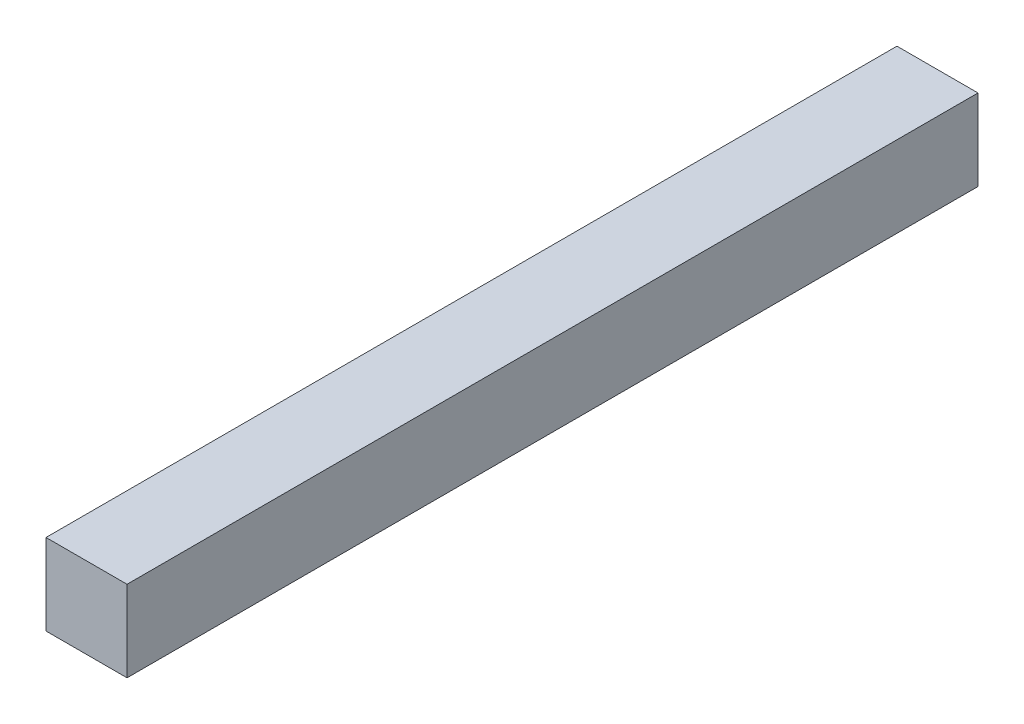
ISO-10303-21;
HEADER;
FILE_DESCRIPTION(('STEP AP214'),'2;1');
FILE_NAME('part.step','',(''),(''),'','','');
FILE_SCHEMA(('AUTOMOTIVE_DESIGN { 1 0 10303 214 1 1 1 1 }'));
ENDSEC;
DATA;
#1=APPLICATION_CONTEXT('core data for automotive mechanical design processes');
#2=APPLICATION_PROTOCOL_DEFINITION('international standard','automotive_design',2000,#1);
#3=PRODUCT_CONTEXT('',#1,'mechanical');
#4=PRODUCT('Part','Part','',(#3));
#5=PRODUCT_RELATED_PRODUCT_CATEGORY('part','',(#4));
#6=PRODUCT_DEFINITION_FORMATION('','',#4);
#7=PRODUCT_DEFINITION_CONTEXT('part definition',#1,'design');
#8=PRODUCT_DEFINITION('design','',#6,#7);
#9=PRODUCT_DEFINITION_SHAPE('','',#8);
#10=(LENGTH_UNIT() NAMED_UNIT(*) SI_UNIT(.MILLI.,.METRE.));
#11=(NAMED_UNIT(*) PLANE_ANGLE_UNIT() SI_UNIT($,.RADIAN.));
#12=(NAMED_UNIT(*) SI_UNIT($,.STERADIAN.) SOLID_ANGLE_UNIT());
#13=UNCERTAINTY_MEASURE_WITH_UNIT(LENGTH_MEASURE(1.E-05),#10,'distance_accuracy_value','');
#14=(GEOMETRIC_REPRESENTATION_CONTEXT(3) GLOBAL_UNCERTAINTY_ASSIGNED_CONTEXT((#13)) GLOBAL_UNIT_ASSIGNED_CONTEXT((#10,
#11,#12)) REPRESENTATION_CONTEXT('',''));
#15=CARTESIAN_POINT('',(0.,0.,0.));
#16=DIRECTION('',(0.,0.,1.));
#17=DIRECTION('',(1.,0.,0.));
#18=AXIS2_PLACEMENT_3D('',#15,#16,#17);
#19=CARTESIAN_POINT('',(0.,0.,66.675));
#20=DIRECTION('',(-1.,0.,0.));
#21=DIRECTION('',(0.,-1.,0.));
#22=AXIS2_PLACEMENT_3D('',#19,#20,#21);
#23=PLANE('',#22);
#24=DIRECTION('',(0.,1.,0.));
#25=VECTOR('',#24,1.);
#26=CARTESIAN_POINT('',(0.,0.,0.));
#27=LINE('',#26,#25);
#28=CARTESIAN_POINT('',(0.,0.,0.));
#29=VERTEX_POINT('',#28);
#30=CARTESIAN_POINT('',(0.,6.35,0.));
#31=VERTEX_POINT('',#30);
#32=EDGE_CURVE('E96',#29,#31,#27,.T.);
#33=ORIENTED_EDGE('',*,*,#32,.T.);
#34=DIRECTION('',(0.,0.,-1.));
#35=VECTOR('',#34,1.);
#36=CARTESIAN_POINT('',(0.,6.35,66.675));
#37=LINE('',#36,#35);
#38=CARTESIAN_POINT('',(0.,6.35,66.675));
#39=VERTEX_POINT('',#38);
#40=EDGE_CURVE('E11',#39,#31,#37,.T.);
#41=ORIENTED_EDGE('',*,*,#40,.F.);
#42=DIRECTION('',(0.,1.,0.));
#43=VECTOR('',#42,1.);
#44=CARTESIAN_POINT('',(0.,0.,66.675));
#45=LINE('',#44,#43);
#46=CARTESIAN_POINT('',(0.,0.,66.675));
#47=VERTEX_POINT('',#46);
#48=EDGE_CURVE('E84',#47,#39,#45,.T.);
#49=ORIENTED_EDGE('',*,*,#48,.F.);
#50=DIRECTION('',(0.,0.,-1.));
#51=VECTOR('',#50,1.);
#52=CARTESIAN_POINT('',(0.,0.,66.675));
#53=LINE('',#52,#51);
#54=EDGE_CURVE('E92',#47,#29,#53,.T.);
#55=ORIENTED_EDGE('',*,*,#54,.T.);
#56=EDGE_LOOP('',(#33,#41,#49,#55));
#57=FACE_BOUND('',#56,.T.);
#58=ADVANCED_FACE('F33',(#57),#23,.F.);
#59=CARTESIAN_POINT('',(0.,6.35,66.675));
#60=DIRECTION('',(0.,-1.,0.));
#61=DIRECTION('',(1.,0.,0.));
#62=AXIS2_PLACEMENT_3D('',#59,#60,#61);
#63=PLANE('',#62);
#64=DIRECTION('',(-1.,0.,0.));
#65=VECTOR('',#64,1.);
#66=CARTESIAN_POINT('',(0.,6.35,0.));
#67=LINE('',#66,#65);
#68=CARTESIAN_POINT('',(-6.35,6.35,0.));
#69=VERTEX_POINT('',#68);
#70=EDGE_CURVE('E88',#31,#69,#67,.T.);
#71=ORIENTED_EDGE('',*,*,#70,.T.);
#72=DIRECTION('',(0.,0.,-1.));
#73=VECTOR('',#72,1.);
#74=CARTESIAN_POINT('',(-6.35,6.35,66.675));
#75=LINE('',#74,#73);
#76=CARTESIAN_POINT('',(-6.35,6.35,66.675));
#77=VERTEX_POINT('',#76);
#78=EDGE_CURVE('E41',#77,#69,#75,.T.);
#79=ORIENTED_EDGE('',*,*,#78,.F.);
#80=DIRECTION('',(-1.,0.,0.));
#81=VECTOR('',#80,1.);
#82=CARTESIAN_POINT('',(0.,6.35,66.675));
#83=LINE('',#82,#81);
#84=EDGE_CURVE('E79',#39,#77,#83,.T.);
#85=ORIENTED_EDGE('',*,*,#84,.F.);
#86=ORIENTED_EDGE('',*,*,#40,.T.);
#87=EDGE_LOOP('',(#71,#79,#85,#86));
#88=FACE_BOUND('',#87,.T.);
#89=ADVANCED_FACE('F87',(#88),#63,.F.);
#90=CARTESIAN_POINT('',(-6.35,0.,66.675));
#91=DIRECTION('',(1.,0.,0.));
#92=DIRECTION('',(0.,0.,-1.));
#93=AXIS2_PLACEMENT_3D('',#90,#91,#92);
#94=PLANE('',#93);
#95=DIRECTION('',(0.,-1.,0.));
#96=VECTOR('',#95,1.);
#97=CARTESIAN_POINT('',(-6.35,0.,0.));
#98=LINE('',#97,#96);
#99=CARTESIAN_POINT('',(-6.35,0.,0.));
#100=VERTEX_POINT('',#99);
#101=EDGE_CURVE('E66',#69,#100,#98,.T.);
#102=ORIENTED_EDGE('',*,*,#101,.T.);
#103=DIRECTION('',(0.,0.,-1.));
#104=VECTOR('',#103,1.);
#105=CARTESIAN_POINT('',(-6.35,0.,66.675));
#106=LINE('',#105,#104);
#107=CARTESIAN_POINT('',(-6.35,0.,66.675));
#108=VERTEX_POINT('',#107);
#109=EDGE_CURVE('E89',#108,#100,#106,.T.);
#110=ORIENTED_EDGE('',*,*,#109,.F.);
#111=DIRECTION('',(0.,-1.,0.));
#112=VECTOR('',#111,1.);
#113=CARTESIAN_POINT('',(-6.35,0.,66.675));
#114=LINE('',#113,#112);
#115=EDGE_CURVE('E82',#77,#108,#114,.T.);
#116=ORIENTED_EDGE('',*,*,#115,.F.);
#117=ORIENTED_EDGE('',*,*,#78,.T.);
#118=EDGE_LOOP('',(#102,#110,#116,#117));
#119=FACE_BOUND('',#118,.T.);
#120=ADVANCED_FACE('F90',(#119),#94,.F.);
#121=CARTESIAN_POINT('',(0.,0.,66.675));
#122=DIRECTION('',(0.,1.,0.));
#123=DIRECTION('',(0.,0.,1.));
#124=AXIS2_PLACEMENT_3D('',#121,#122,#123);
#125=PLANE('',#124);
#126=DIRECTION('',(1.,0.,0.));
#127=VECTOR('',#126,1.);
#128=CARTESIAN_POINT('',(0.,0.,0.));
#129=LINE('',#128,#127);
#130=EDGE_CURVE('E72',#100,#29,#129,.T.);
#131=ORIENTED_EDGE('',*,*,#130,.T.);
#132=ORIENTED_EDGE('',*,*,#54,.F.);
#133=DIRECTION('',(1.,0.,0.));
#134=VECTOR('',#133,1.);
#135=CARTESIAN_POINT('',(0.,0.,66.675));
#136=LINE('',#135,#134);
#137=EDGE_CURVE('E49',#108,#47,#136,.T.);
#138=ORIENTED_EDGE('',*,*,#137,.F.);
#139=ORIENTED_EDGE('',*,*,#109,.T.);
#140=EDGE_LOOP('',(#131,#132,#138,#139));
#141=FACE_BOUND('',#140,.T.);
#142=ADVANCED_FACE('F103',(#141),#125,.F.);
#143=CARTESIAN_POINT('',(0.,0.,66.675));
#144=DIRECTION('',(0.,0.,1.));
#145=DIRECTION('',(1.,0.,0.));
#146=AXIS2_PLACEMENT_3D('',#143,#144,#145);
#147=PLANE('',#146);
#148=ORIENTED_EDGE('',*,*,#48,.T.);
#149=ORIENTED_EDGE('',*,*,#84,.T.);
#150=ORIENTED_EDGE('',*,*,#115,.T.);
#151=ORIENTED_EDGE('',*,*,#137,.T.);
#152=EDGE_LOOP('',(#148,#149,#150,#151));
#153=FACE_BOUND('',#152,.T.);
#154=ADVANCED_FACE('F80',(#153),#147,.T.);
#155=CARTESIAN_POINT('',(0.,0.,0.));
#156=DIRECTION('',(0.,0.,1.));
#157=DIRECTION('',(1.,0.,0.));
#158=AXIS2_PLACEMENT_3D('',#155,#156,#157);
#159=PLANE('',#158);
#160=ORIENTED_EDGE('',*,*,#32,.F.);
#161=ORIENTED_EDGE('',*,*,#130,.F.);
#162=ORIENTED_EDGE('',*,*,#101,.F.);
#163=ORIENTED_EDGE('',*,*,#70,.F.);
#164=EDGE_LOOP('',(#160,#161,#162,#163));
#165=FACE_BOUND('',#164,.T.);
#166=ADVANCED_FACE('F106',(#165),#159,.F.);
#167=CLOSED_SHELL('',(#58,#89,#120,#142,#154,#166));
#168=MANIFOLD_SOLID_BREP('B2',#167);
#169=ADVANCED_BREP_SHAPE_REPRESENTATION('',(#18,#168),#14);
#170=SHAPE_DEFINITION_REPRESENTATION(#9,#169);
ENDSEC;
END-ISO-10303-21;
